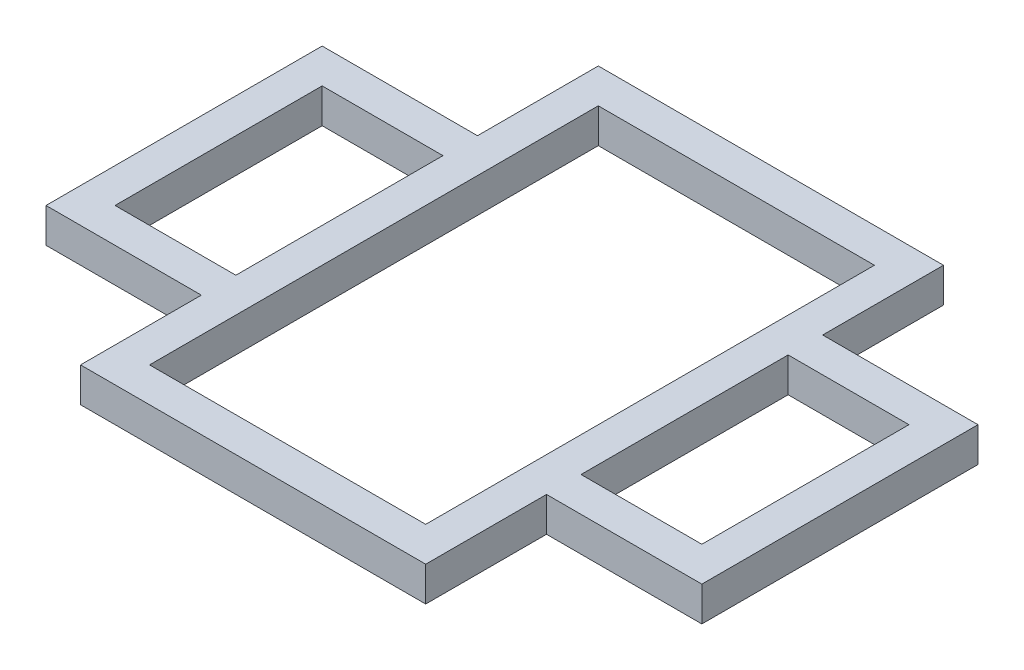
ISO-10303-21;
HEADER;
FILE_DESCRIPTION(('STEP AP214'),'2;1');
FILE_NAME('part.step','',(''),(''),'','','');
FILE_SCHEMA(('AUTOMOTIVE_DESIGN { 1 0 10303 214 1 1 1 1 }'));
ENDSEC;
DATA;
#1=APPLICATION_CONTEXT('core data for automotive mechanical design processes');
#2=APPLICATION_PROTOCOL_DEFINITION('international standard','automotive_design',2000,#1);
#3=PRODUCT_CONTEXT('',#1,'mechanical');
#4=PRODUCT('Part','Part','',(#3));
#5=PRODUCT_RELATED_PRODUCT_CATEGORY('part','',(#4));
#6=PRODUCT_DEFINITION_FORMATION('','',#4);
#7=PRODUCT_DEFINITION_CONTEXT('part definition',#1,'design');
#8=PRODUCT_DEFINITION('design','',#6,#7);
#9=PRODUCT_DEFINITION_SHAPE('','',#8);
#10=(LENGTH_UNIT() NAMED_UNIT(*) SI_UNIT(.MILLI.,.METRE.));
#11=(NAMED_UNIT(*) PLANE_ANGLE_UNIT() SI_UNIT($,.RADIAN.));
#12=(NAMED_UNIT(*) SI_UNIT($,.STERADIAN.) SOLID_ANGLE_UNIT());
#13=UNCERTAINTY_MEASURE_WITH_UNIT(LENGTH_MEASURE(1.E-05),#10,'distance_accuracy_value','');
#14=(GEOMETRIC_REPRESENTATION_CONTEXT(3) GLOBAL_UNCERTAINTY_ASSIGNED_CONTEXT((#13)) GLOBAL_UNIT_ASSIGNED_CONTEXT((#10,
#11,#12)) REPRESENTATION_CONTEXT('',''));
#15=CARTESIAN_POINT('',(0.,0.,0.));
#16=DIRECTION('',(0.,0.,1.));
#17=DIRECTION('',(1.,0.,0.));
#18=AXIS2_PLACEMENT_3D('',#15,#16,#17);
#19=CARTESIAN_POINT('',(0.,20.,0.));
#20=DIRECTION('',(0.,-1.,0.));
#21=DIRECTION('',(0.,0.,-1.));
#22=AXIS2_PLACEMENT_3D('',#19,#20,#21);
#23=PLANE('',#22);
#24=DIRECTION('',(0.,0.,1.));
#25=VECTOR('',#24,1.);
#26=CARTESIAN_POINT('',(100.,20.,60.));
#27=LINE('',#26,#25);
#28=CARTESIAN_POINT('',(100.,20.,-60.));
#29=VERTEX_POINT('',#28);
#30=CARTESIAN_POINT('',(100.,20.,60.));
#31=VERTEX_POINT('',#30);
#32=EDGE_CURVE('E230',#29,#31,#27,.T.);
#33=ORIENTED_EDGE('',*,*,#32,.F.);
#34=DIRECTION('',(-1.,0.,0.));
#35=VECTOR('',#34,1.);
#36=CARTESIAN_POINT('',(170.,20.,-60.));
#37=LINE('',#36,#35);
#38=CARTESIAN_POINT('',(170.,20.,-60.));
#39=VERTEX_POINT('',#38);
#40=EDGE_CURVE('E238',#39,#29,#37,.T.);
#41=ORIENTED_EDGE('',*,*,#40,.F.);
#42=DIRECTION('',(0.,0.,-1.));
#43=VECTOR('',#42,1.);
#44=CARTESIAN_POINT('',(170.,20.,-60.));
#45=LINE('',#44,#43);
#46=CARTESIAN_POINT('',(170.,20.,60.));
#47=VERTEX_POINT('',#46);
#48=EDGE_CURVE('E235',#47,#39,#45,.T.);
#49=ORIENTED_EDGE('',*,*,#48,.F.);
#50=DIRECTION('',(1.,0.,0.));
#51=VECTOR('',#50,1.);
#52=CARTESIAN_POINT('',(170.,20.,60.));
#53=LINE('',#52,#51);
#54=EDGE_CURVE('E232',#31,#47,#53,.T.);
#55=ORIENTED_EDGE('',*,*,#54,.F.);
#56=EDGE_LOOP('',(#33,#41,#49,#55));
#57=FACE_BOUND('',#56,.T.);
#58=DIRECTION('',(0.,0.,1.));
#59=VECTOR('',#58,1.);
#60=CARTESIAN_POINT('',(-100.,20.,-150.));
#61=LINE('',#60,#59);
#62=CARTESIAN_POINT('',(-100.,20.,-150.));
#63=VERTEX_POINT('',#62);
#64=CARTESIAN_POINT('',(-100.,20.,-80.));
#65=VERTEX_POINT('',#64);
#66=EDGE_CURVE('E293',#63,#65,#61,.T.);
#67=ORIENTED_EDGE('',*,*,#66,.T.);
#68=DIRECTION('',(-1.,0.,0.));
#69=VECTOR('',#68,1.);
#70=CARTESIAN_POINT('',(-100.,20.,-80.));
#71=LINE('',#70,#69);
#72=CARTESIAN_POINT('',(-190.,20.,-80.));
#73=VERTEX_POINT('',#72);
#74=EDGE_CURVE('E296',#65,#73,#71,.T.);
#75=ORIENTED_EDGE('',*,*,#74,.T.);
#76=DIRECTION('',(0.,0.,1.));
#77=VECTOR('',#76,1.);
#78=CARTESIAN_POINT('',(-190.,20.,-80.));
#79=LINE('',#78,#77);
#80=CARTESIAN_POINT('',(-190.,20.,80.));
#81=VERTEX_POINT('',#80);
#82=EDGE_CURVE('E299',#73,#81,#79,.T.);
#83=ORIENTED_EDGE('',*,*,#82,.T.);
#84=DIRECTION('',(1.,0.,0.));
#85=VECTOR('',#84,1.);
#86=CARTESIAN_POINT('',(-100.,20.,80.));
#87=LINE('',#86,#85);
#88=CARTESIAN_POINT('',(-100.,20.,80.));
#89=VERTEX_POINT('',#88);
#90=EDGE_CURVE('E301',#81,#89,#87,.T.);
#91=ORIENTED_EDGE('',*,*,#90,.T.);
#92=DIRECTION('',(0.,0.,1.));
#93=VECTOR('',#92,1.);
#94=CARTESIAN_POINT('',(-100.,20.,80.));
#95=LINE('',#94,#93);
#96=CARTESIAN_POINT('',(-100.,20.,150.));
#97=VERTEX_POINT('',#96);
#98=EDGE_CURVE('E303',#89,#97,#95,.T.);
#99=ORIENTED_EDGE('',*,*,#98,.T.);
#100=DIRECTION('',(1.,0.,0.));
#101=VECTOR('',#100,1.);
#102=CARTESIAN_POINT('',(100.,20.,150.));
#103=LINE('',#102,#101);
#104=CARTESIAN_POINT('',(100.,20.,150.));
#105=VERTEX_POINT('',#104);
#106=EDGE_CURVE('E305',#97,#105,#103,.T.);
#107=ORIENTED_EDGE('',*,*,#106,.T.);
#108=DIRECTION('',(0.,0.,-1.));
#109=VECTOR('',#108,1.);
#110=CARTESIAN_POINT('',(100.,20.,150.));
#111=LINE('',#110,#109);
#112=CARTESIAN_POINT('',(100.,20.,80.));
#113=VERTEX_POINT('',#112);
#114=EDGE_CURVE('E307',#105,#113,#111,.T.);
#115=ORIENTED_EDGE('',*,*,#114,.T.);
#116=DIRECTION('',(1.,0.,0.));
#117=VECTOR('',#116,1.);
#118=CARTESIAN_POINT('',(190.,20.,80.));
#119=LINE('',#118,#117);
#120=CARTESIAN_POINT('',(190.,20.,80.));
#121=VERTEX_POINT('',#120);
#122=EDGE_CURVE('E309',#113,#121,#119,.T.);
#123=ORIENTED_EDGE('',*,*,#122,.T.);
#124=DIRECTION('',(0.,0.,-1.));
#125=VECTOR('',#124,1.);
#126=CARTESIAN_POINT('',(190.,20.,-80.));
#127=LINE('',#126,#125);
#128=CARTESIAN_POINT('',(190.,20.,-80.));
#129=VERTEX_POINT('',#128);
#130=EDGE_CURVE('E311',#121,#129,#127,.T.);
#131=ORIENTED_EDGE('',*,*,#130,.T.);
#132=DIRECTION('',(-1.,0.,0.));
#133=VECTOR('',#132,1.);
#134=CARTESIAN_POINT('',(190.,20.,-80.));
#135=LINE('',#134,#133);
#136=CARTESIAN_POINT('',(100.,20.,-80.));
#137=VERTEX_POINT('',#136);
#138=EDGE_CURVE('E313',#129,#137,#135,.T.);
#139=ORIENTED_EDGE('',*,*,#138,.T.);
#140=DIRECTION('',(0.,0.,-1.));
#141=VECTOR('',#140,1.);
#142=CARTESIAN_POINT('',(100.,20.,-80.));
#143=LINE('',#142,#141);
#144=CARTESIAN_POINT('',(100.,20.,-150.));
#145=VERTEX_POINT('',#144);
#146=EDGE_CURVE('E315',#137,#145,#143,.T.);
#147=ORIENTED_EDGE('',*,*,#146,.T.);
#148=DIRECTION('',(-1.,0.,0.));
#149=VECTOR('',#148,1.);
#150=CARTESIAN_POINT('',(-100.,20.,-150.));
#151=LINE('',#150,#149);
#152=EDGE_CURVE('E317',#145,#63,#151,.T.);
#153=ORIENTED_EDGE('',*,*,#152,.T.);
#154=EDGE_LOOP('',(#67,#75,#83,#91,#99,#107,#115,#123,#131,#139,#147,#153));
#155=FACE_BOUND('',#154,.T.);
#156=DIRECTION('',(0.,0.,1.));
#157=VECTOR('',#156,1.);
#158=CARTESIAN_POINT('',(-80.,20.,-60.));
#159=LINE('',#158,#157);
#160=CARTESIAN_POINT('',(-80.,20.,-130.));
#161=VERTEX_POINT('',#160);
#162=CARTESIAN_POINT('',(-80.,20.,130.));
#163=VERTEX_POINT('',#162);
#164=EDGE_CURVE('E261',#161,#163,#159,.T.);
#165=ORIENTED_EDGE('',*,*,#164,.F.);
#166=DIRECTION('',(-1.,0.,0.));
#167=VECTOR('',#166,1.);
#168=CARTESIAN_POINT('',(10.,20.,-130.));
#169=LINE('',#168,#167);
#170=CARTESIAN_POINT('',(80.,20.,-130.));
#171=VERTEX_POINT('',#170);
#172=EDGE_CURVE('E269',#171,#161,#169,.T.);
#173=ORIENTED_EDGE('',*,*,#172,.F.);
#174=DIRECTION('',(0.,0.,-1.));
#175=VECTOR('',#174,1.);
#176=CARTESIAN_POINT('',(80.,20.,60.));
#177=LINE('',#176,#175);
#178=CARTESIAN_POINT('',(80.,20.,130.));
#179=VERTEX_POINT('',#178);
#180=EDGE_CURVE('E266',#179,#171,#177,.T.);
#181=ORIENTED_EDGE('',*,*,#180,.F.);
#182=DIRECTION('',(1.,0.,0.));
#183=VECTOR('',#182,1.);
#184=CARTESIAN_POINT('',(-9.99999999999999,20.,130.));
#185=LINE('',#184,#183);
#186=EDGE_CURVE('E263',#163,#179,#185,.T.);
#187=ORIENTED_EDGE('',*,*,#186,.F.);
#188=EDGE_LOOP('',(#165,#173,#181,#187));
#189=FACE_BOUND('',#188,.T.);
#190=DIRECTION('',(0.,0.,-1.));
#191=VECTOR('',#190,1.);
#192=CARTESIAN_POINT('',(-100.,20.,-60.));
#193=LINE('',#192,#191);
#194=CARTESIAN_POINT('',(-100.,20.,60.));
#195=VERTEX_POINT('',#194);
#196=CARTESIAN_POINT('',(-100.,20.,-60.));
#197=VERTEX_POINT('',#196);
#198=EDGE_CURVE('E194',#195,#197,#193,.T.);
#199=ORIENTED_EDGE('',*,*,#198,.F.);
#200=DIRECTION('',(1.,0.,0.));
#201=VECTOR('',#200,1.);
#202=CARTESIAN_POINT('',(-100.,20.,60.));
#203=LINE('',#202,#201);
#204=CARTESIAN_POINT('',(-170.,20.,60.));
#205=VERTEX_POINT('',#204);
#206=EDGE_CURVE('E216',#205,#195,#203,.T.);
#207=ORIENTED_EDGE('',*,*,#206,.F.);
#208=DIRECTION('',(0.,0.,1.));
#209=VECTOR('',#208,1.);
#210=CARTESIAN_POINT('',(-170.,20.,-60.));
#211=LINE('',#210,#209);
#212=CARTESIAN_POINT('',(-170.,20.,-60.));
#213=VERTEX_POINT('',#212);
#214=EDGE_CURVE('E214',#213,#205,#211,.T.);
#215=ORIENTED_EDGE('',*,*,#214,.F.);
#216=DIRECTION('',(-1.,0.,0.));
#217=VECTOR('',#216,1.);
#218=CARTESIAN_POINT('',(-100.,20.,-60.));
#219=LINE('',#218,#217);
#220=EDGE_CURVE('E202',#197,#213,#219,.T.);
#221=ORIENTED_EDGE('',*,*,#220,.F.);
#222=EDGE_LOOP('',(#199,#207,#215,#221));
#223=FACE_BOUND('',#222,.T.);
#224=ADVANCED_FACE('F33',(#57,#155,#189,#223),#23,.F.);
#225=CARTESIAN_POINT('',(0.,0.,0.));
#226=DIRECTION('',(0.,-1.,0.));
#227=DIRECTION('',(0.,0.,-1.));
#228=AXIS2_PLACEMENT_3D('',#225,#226,#227);
#229=PLANE('',#228);
#230=DIRECTION('',(0.,0.,1.));
#231=VECTOR('',#230,1.);
#232=CARTESIAN_POINT('',(-100.,0.,-150.));
#233=LINE('',#232,#231);
#234=CARTESIAN_POINT('',(-100.,0.,-150.));
#235=VERTEX_POINT('',#234);
#236=CARTESIAN_POINT('',(-100.,0.,-80.));
#237=VERTEX_POINT('',#236);
#238=EDGE_CURVE('E292',#235,#237,#233,.T.);
#239=ORIENTED_EDGE('',*,*,#238,.F.);
#240=DIRECTION('',(-1.,0.,0.));
#241=VECTOR('',#240,1.);
#242=CARTESIAN_POINT('',(-100.,0.,-150.));
#243=LINE('',#242,#241);
#244=CARTESIAN_POINT('',(100.,0.,-150.));
#245=VERTEX_POINT('',#244);
#246=EDGE_CURVE('E297',#245,#235,#243,.T.);
#247=ORIENTED_EDGE('',*,*,#246,.F.);
#248=DIRECTION('',(0.,0.,-1.));
#249=VECTOR('',#248,1.);
#250=CARTESIAN_POINT('',(100.,0.,-80.));
#251=LINE('',#250,#249);
#252=CARTESIAN_POINT('',(100.,0.,-80.));
#253=VERTEX_POINT('',#252);
#254=EDGE_CURVE('E340',#253,#245,#251,.T.);
#255=ORIENTED_EDGE('',*,*,#254,.F.);
#256=DIRECTION('',(-1.,0.,0.));
#257=VECTOR('',#256,1.);
#258=CARTESIAN_POINT('',(190.,0.,-80.));
#259=LINE('',#258,#257);
#260=CARTESIAN_POINT('',(190.,0.,-80.));
#261=VERTEX_POINT('',#260);
#262=EDGE_CURVE('E338',#261,#253,#259,.T.);
#263=ORIENTED_EDGE('',*,*,#262,.F.);
#264=DIRECTION('',(0.,0.,-1.));
#265=VECTOR('',#264,1.);
#266=CARTESIAN_POINT('',(190.,0.,-80.));
#267=LINE('',#266,#265);
#268=CARTESIAN_POINT('',(190.,0.,80.));
#269=VERTEX_POINT('',#268);
#270=EDGE_CURVE('E336',#269,#261,#267,.T.);
#271=ORIENTED_EDGE('',*,*,#270,.F.);
#272=DIRECTION('',(1.,0.,0.));
#273=VECTOR('',#272,1.);
#274=CARTESIAN_POINT('',(190.,0.,80.));
#275=LINE('',#274,#273);
#276=CARTESIAN_POINT('',(100.,0.,80.));
#277=VERTEX_POINT('',#276);
#278=EDGE_CURVE('E334',#277,#269,#275,.T.);
#279=ORIENTED_EDGE('',*,*,#278,.F.);
#280=DIRECTION('',(0.,0.,-1.));
#281=VECTOR('',#280,1.);
#282=CARTESIAN_POINT('',(100.,0.,150.));
#283=LINE('',#282,#281);
#284=CARTESIAN_POINT('',(100.,0.,150.));
#285=VERTEX_POINT('',#284);
#286=EDGE_CURVE('E332',#285,#277,#283,.T.);
#287=ORIENTED_EDGE('',*,*,#286,.F.);
#288=DIRECTION('',(1.,0.,0.));
#289=VECTOR('',#288,1.);
#290=CARTESIAN_POINT('',(100.,0.,150.));
#291=LINE('',#290,#289);
#292=CARTESIAN_POINT('',(-100.,0.,150.));
#293=VERTEX_POINT('',#292);
#294=EDGE_CURVE('E330',#293,#285,#291,.T.);
#295=ORIENTED_EDGE('',*,*,#294,.F.);
#296=DIRECTION('',(0.,0.,1.));
#297=VECTOR('',#296,1.);
#298=CARTESIAN_POINT('',(-100.,0.,80.));
#299=LINE('',#298,#297);
#300=CARTESIAN_POINT('',(-100.,0.,80.));
#301=VERTEX_POINT('',#300);
#302=EDGE_CURVE('E328',#301,#293,#299,.T.);
#303=ORIENTED_EDGE('',*,*,#302,.F.);
#304=DIRECTION('',(1.,0.,0.));
#305=VECTOR('',#304,1.);
#306=CARTESIAN_POINT('',(-100.,0.,80.));
#307=LINE('',#306,#305);
#308=CARTESIAN_POINT('',(-190.,0.,80.));
#309=VERTEX_POINT('',#308);
#310=EDGE_CURVE('E326',#309,#301,#307,.T.);
#311=ORIENTED_EDGE('',*,*,#310,.F.);
#312=DIRECTION('',(0.,0.,1.));
#313=VECTOR('',#312,1.);
#314=CARTESIAN_POINT('',(-190.,0.,-80.));
#315=LINE('',#314,#313);
#316=CARTESIAN_POINT('',(-190.,0.,-80.));
#317=VERTEX_POINT('',#316);
#318=EDGE_CURVE('E324',#317,#309,#315,.T.);
#319=ORIENTED_EDGE('',*,*,#318,.F.);
#320=DIRECTION('',(-1.,0.,0.));
#321=VECTOR('',#320,1.);
#322=CARTESIAN_POINT('',(-100.,0.,-80.));
#323=LINE('',#322,#321);
#324=EDGE_CURVE('E322',#237,#317,#323,.T.);
#325=ORIENTED_EDGE('',*,*,#324,.F.);
#326=EDGE_LOOP('',(#239,#247,#255,#263,#271,#279,#287,#295,#303,#311,#319,#325));
#327=FACE_BOUND('',#326,.T.);
#328=DIRECTION('',(-1.,0.,0.));
#329=VECTOR('',#328,1.);
#330=CARTESIAN_POINT('',(-80.,0.,-130.));
#331=LINE('',#330,#329);
#332=CARTESIAN_POINT('',(80.,0.,-130.));
#333=VERTEX_POINT('',#332);
#334=CARTESIAN_POINT('',(-80.,0.,-130.));
#335=VERTEX_POINT('',#334);
#336=EDGE_CURVE('E264',#333,#335,#331,.T.);
#337=ORIENTED_EDGE('',*,*,#336,.T.);
#338=DIRECTION('',(0.,0.,1.));
#339=VECTOR('',#338,1.);
#340=CARTESIAN_POINT('',(-80.,0.,130.));
#341=LINE('',#340,#339);
#342=CARTESIAN_POINT('',(-80.,0.,130.));
#343=VERTEX_POINT('',#342);
#344=EDGE_CURVE('E260',#335,#343,#341,.T.);
#345=ORIENTED_EDGE('',*,*,#344,.T.);
#346=DIRECTION('',(1.,0.,0.));
#347=VECTOR('',#346,1.);
#348=CARTESIAN_POINT('',(80.,0.,130.));
#349=LINE('',#348,#347);
#350=CARTESIAN_POINT('',(80.,0.,130.));
#351=VERTEX_POINT('',#350);
#352=EDGE_CURVE('E274',#343,#351,#349,.T.);
#353=ORIENTED_EDGE('',*,*,#352,.T.);
#354=DIRECTION('',(0.,0.,-1.));
#355=VECTOR('',#354,1.);
#356=CARTESIAN_POINT('',(80.,0.,-130.));
#357=LINE('',#356,#355);
#358=EDGE_CURVE('E277',#351,#333,#357,.T.);
#359=ORIENTED_EDGE('',*,*,#358,.T.);
#360=EDGE_LOOP('',(#337,#345,#353,#359));
#361=FACE_BOUND('',#360,.T.);
#362=DIRECTION('',(-1.,0.,0.));
#363=VECTOR('',#362,1.);
#364=CARTESIAN_POINT('',(170.,0.,-60.));
#365=LINE('',#364,#363);
#366=CARTESIAN_POINT('',(170.,0.,-60.));
#367=VERTEX_POINT('',#366);
#368=CARTESIAN_POINT('',(100.,0.,-60.));
#369=VERTEX_POINT('',#368);
#370=EDGE_CURVE('E233',#367,#369,#365,.T.);
#371=ORIENTED_EDGE('',*,*,#370,.T.);
#372=DIRECTION('',(0.,0.,1.));
#373=VECTOR('',#372,1.);
#374=CARTESIAN_POINT('',(100.,0.,60.));
#375=LINE('',#374,#373);
#376=CARTESIAN_POINT('',(100.,0.,60.));
#377=VERTEX_POINT('',#376);
#378=EDGE_CURVE('E210',#369,#377,#375,.T.);
#379=ORIENTED_EDGE('',*,*,#378,.T.);
#380=DIRECTION('',(1.,0.,0.));
#381=VECTOR('',#380,1.);
#382=CARTESIAN_POINT('',(170.,0.,60.));
#383=LINE('',#382,#381);
#384=CARTESIAN_POINT('',(170.,0.,60.));
#385=VERTEX_POINT('',#384);
#386=EDGE_CURVE('E243',#377,#385,#383,.T.);
#387=ORIENTED_EDGE('',*,*,#386,.T.);
#388=DIRECTION('',(0.,0.,-1.));
#389=VECTOR('',#388,1.);
#390=CARTESIAN_POINT('',(170.,0.,-60.));
#391=LINE('',#390,#389);
#392=EDGE_CURVE('E246',#385,#367,#391,.T.);
#393=ORIENTED_EDGE('',*,*,#392,.T.);
#394=EDGE_LOOP('',(#371,#379,#387,#393));
#395=FACE_BOUND('',#394,.T.);
#396=DIRECTION('',(1.,0.,0.));
#397=VECTOR('',#396,1.);
#398=CARTESIAN_POINT('',(-100.,0.,60.));
#399=LINE('',#398,#397);
#400=CARTESIAN_POINT('',(-170.,0.,60.));
#401=VERTEX_POINT('',#400);
#402=CARTESIAN_POINT('',(-100.,0.,60.));
#403=VERTEX_POINT('',#402);
#404=EDGE_CURVE('E203',#401,#403,#399,.T.);
#405=ORIENTED_EDGE('',*,*,#404,.T.);
#406=DIRECTION('',(0.,0.,-1.));
#407=VECTOR('',#406,1.);
#408=CARTESIAN_POINT('',(-100.,0.,-60.));
#409=LINE('',#408,#407);
#410=CARTESIAN_POINT('',(-100.,0.,-60.));
#411=VERTEX_POINT('',#410);
#412=EDGE_CURVE('E56',#403,#411,#409,.T.);
#413=ORIENTED_EDGE('',*,*,#412,.T.);
#414=DIRECTION('',(-1.,0.,0.));
#415=VECTOR('',#414,1.);
#416=CARTESIAN_POINT('',(-100.,0.,-60.));
#417=LINE('',#416,#415);
#418=CARTESIAN_POINT('',(-170.,0.,-60.));
#419=VERTEX_POINT('',#418);
#420=EDGE_CURVE('E209',#411,#419,#417,.T.);
#421=ORIENTED_EDGE('',*,*,#420,.T.);
#422=DIRECTION('',(0.,0.,1.));
#423=VECTOR('',#422,1.);
#424=CARTESIAN_POINT('',(-170.,0.,-60.));
#425=LINE('',#424,#423);
#426=EDGE_CURVE('E222',#419,#401,#425,.T.);
#427=ORIENTED_EDGE('',*,*,#426,.T.);
#428=EDGE_LOOP('',(#405,#413,#421,#427));
#429=FACE_BOUND('',#428,.T.);
#430=ADVANCED_FACE('F382',(#327,#361,#395,#429),#229,.T.);
#431=CARTESIAN_POINT('',(-100.,20.,-150.));
#432=DIRECTION('',(1.,0.,0.));
#433=DIRECTION('',(0.,0.,-1.));
#434=AXIS2_PLACEMENT_3D('',#431,#432,#433);
#435=PLANE('',#434);
#436=ORIENTED_EDGE('',*,*,#238,.T.);
#437=DIRECTION('',(0.,-1.,0.));
#438=VECTOR('',#437,1.);
#439=CARTESIAN_POINT('',(-100.,20.,-80.));
#440=LINE('',#439,#438);
#441=EDGE_CURVE('E11',#65,#237,#440,.T.);
#442=ORIENTED_EDGE('',*,*,#441,.F.);
#443=ORIENTED_EDGE('',*,*,#66,.F.);
#444=DIRECTION('',(0.,-1.,0.));
#445=VECTOR('',#444,1.);
#446=CARTESIAN_POINT('',(-100.,20.,-150.));
#447=LINE('',#446,#445);
#448=EDGE_CURVE('E319',#63,#235,#447,.T.);
#449=ORIENTED_EDGE('',*,*,#448,.T.);
#450=EDGE_LOOP('',(#436,#442,#443,#449));
#451=FACE_BOUND('',#450,.T.);
#452=ADVANCED_FACE('F35',(#451),#435,.F.);
#453=CARTESIAN_POINT('',(-100.,20.,-80.));
#454=DIRECTION('',(0.,0.,1.));
#455=DIRECTION('',(1.,0.,0.));
#456=AXIS2_PLACEMENT_3D('',#453,#454,#455);
#457=PLANE('',#456);
#458=ORIENTED_EDGE('',*,*,#324,.T.);
#459=DIRECTION('',(0.,-1.,0.));
#460=VECTOR('',#459,1.);
#461=CARTESIAN_POINT('',(-190.,20.,-80.));
#462=LINE('',#461,#460);
#463=EDGE_CURVE('E41',#73,#317,#462,.T.);
#464=ORIENTED_EDGE('',*,*,#463,.F.);
#465=ORIENTED_EDGE('',*,*,#74,.F.);
#466=ORIENTED_EDGE('',*,*,#441,.T.);
#467=EDGE_LOOP('',(#458,#464,#465,#466));
#468=FACE_BOUND('',#467,.T.);
#469=ADVANCED_FACE('F400',(#468),#457,.F.);
#470=CARTESIAN_POINT('',(-190.,20.,-80.));
#471=DIRECTION('',(1.,0.,0.));
#472=DIRECTION('',(0.,0.,-1.));
#473=AXIS2_PLACEMENT_3D('',#470,#471,#472);
#474=PLANE('',#473);
#475=ORIENTED_EDGE('',*,*,#318,.T.);
#476=DIRECTION('',(0.,-1.,0.));
#477=VECTOR('',#476,1.);
#478=CARTESIAN_POINT('',(-190.,20.,80.));
#479=LINE('',#478,#477);
#480=EDGE_CURVE('E369',#81,#309,#479,.T.);
#481=ORIENTED_EDGE('',*,*,#480,.F.);
#482=ORIENTED_EDGE('',*,*,#82,.F.);
#483=ORIENTED_EDGE('',*,*,#463,.T.);
#484=EDGE_LOOP('',(#475,#481,#482,#483));
#485=FACE_BOUND('',#484,.T.);
#486=ADVANCED_FACE('F376',(#485),#474,.F.);
#487=CARTESIAN_POINT('',(-100.,20.,80.));
#488=DIRECTION('',(0.,0.,-1.));
#489=DIRECTION('',(-1.,0.,0.));
#490=AXIS2_PLACEMENT_3D('',#487,#488,#489);
#491=PLANE('',#490);
#492=ORIENTED_EDGE('',*,*,#310,.T.);
#493=DIRECTION('',(0.,-1.,0.));
#494=VECTOR('',#493,1.);
#495=CARTESIAN_POINT('',(-100.,20.,80.));
#496=LINE('',#495,#494);
#497=EDGE_CURVE('E366',#89,#301,#496,.T.);
#498=ORIENTED_EDGE('',*,*,#497,.F.);
#499=ORIENTED_EDGE('',*,*,#90,.F.);
#500=ORIENTED_EDGE('',*,*,#480,.T.);
#501=EDGE_LOOP('',(#492,#498,#499,#500));
#502=FACE_BOUND('',#501,.T.);
#503=ADVANCED_FACE('F388',(#502),#491,.F.);
#504=CARTESIAN_POINT('',(-100.,20.,80.));
#505=DIRECTION('',(1.,0.,0.));
#506=DIRECTION('',(0.,0.,-1.));
#507=AXIS2_PLACEMENT_3D('',#504,#505,#506);
#508=PLANE('',#507);
#509=ORIENTED_EDGE('',*,*,#302,.T.);
#510=DIRECTION('',(0.,-1.,0.));
#511=VECTOR('',#510,1.);
#512=CARTESIAN_POINT('',(-100.,20.,150.));
#513=LINE('',#512,#511);
#514=EDGE_CURVE('E363',#97,#293,#513,.T.);
#515=ORIENTED_EDGE('',*,*,#514,.F.);
#516=ORIENTED_EDGE('',*,*,#98,.F.);
#517=ORIENTED_EDGE('',*,*,#497,.T.);
#518=EDGE_LOOP('',(#509,#515,#516,#517));
#519=FACE_BOUND('',#518,.T.);
#520=ADVANCED_FACE('F392',(#519),#508,.F.);
#521=CARTESIAN_POINT('',(100.,20.,150.));
#522=DIRECTION('',(0.,0.,-1.));
#523=DIRECTION('',(-1.,0.,0.));
#524=AXIS2_PLACEMENT_3D('',#521,#522,#523);
#525=PLANE('',#524);
#526=ORIENTED_EDGE('',*,*,#294,.T.);
#527=DIRECTION('',(0.,-1.,0.));
#528=VECTOR('',#527,1.);
#529=CARTESIAN_POINT('',(100.,20.,150.));
#530=LINE('',#529,#528);
#531=EDGE_CURVE('E360',#105,#285,#530,.T.);
#532=ORIENTED_EDGE('',*,*,#531,.F.);
#533=ORIENTED_EDGE('',*,*,#106,.F.);
#534=ORIENTED_EDGE('',*,*,#514,.T.);
#535=EDGE_LOOP('',(#526,#532,#533,#534));
#536=FACE_BOUND('',#535,.T.);
#537=ADVANCED_FACE('F433',(#536),#525,.F.);
#538=CARTESIAN_POINT('',(100.,20.,150.));
#539=DIRECTION('',(-1.,0.,0.));
#540=DIRECTION('',(0.,0.,1.));
#541=AXIS2_PLACEMENT_3D('',#538,#539,#540);
#542=PLANE('',#541);
#543=ORIENTED_EDGE('',*,*,#286,.T.);
#544=DIRECTION('',(0.,-1.,0.));
#545=VECTOR('',#544,1.);
#546=CARTESIAN_POINT('',(100.,20.,80.));
#547=LINE('',#546,#545);
#548=EDGE_CURVE('E357',#113,#277,#547,.T.);
#549=ORIENTED_EDGE('',*,*,#548,.F.);
#550=ORIENTED_EDGE('',*,*,#114,.F.);
#551=ORIENTED_EDGE('',*,*,#531,.T.);
#552=EDGE_LOOP('',(#543,#549,#550,#551));
#553=FACE_BOUND('',#552,.T.);
#554=ADVANCED_FACE('F431',(#553),#542,.F.);
#555=CARTESIAN_POINT('',(190.,20.,80.));
#556=DIRECTION('',(0.,0.,-1.));
#557=DIRECTION('',(-1.,0.,0.));
#558=AXIS2_PLACEMENT_3D('',#555,#556,#557);
#559=PLANE('',#558);
#560=ORIENTED_EDGE('',*,*,#278,.T.);
#561=DIRECTION('',(0.,-1.,0.));
#562=VECTOR('',#561,1.);
#563=CARTESIAN_POINT('',(190.,20.,80.));
#564=LINE('',#563,#562);
#565=EDGE_CURVE('E354',#121,#269,#564,.T.);
#566=ORIENTED_EDGE('',*,*,#565,.F.);
#567=ORIENTED_EDGE('',*,*,#122,.F.);
#568=ORIENTED_EDGE('',*,*,#548,.T.);
#569=EDGE_LOOP('',(#560,#566,#567,#568));
#570=FACE_BOUND('',#569,.T.);
#571=ADVANCED_FACE('F427',(#570),#559,.F.);
#572=CARTESIAN_POINT('',(190.,20.,-80.));
#573=DIRECTION('',(-1.,0.,0.));
#574=DIRECTION('',(0.,0.,1.));
#575=AXIS2_PLACEMENT_3D('',#572,#573,#574);
#576=PLANE('',#575);
#577=ORIENTED_EDGE('',*,*,#270,.T.);
#578=DIRECTION('',(0.,-1.,0.));
#579=VECTOR('',#578,1.);
#580=CARTESIAN_POINT('',(190.,20.,-80.));
#581=LINE('',#580,#579);
#582=EDGE_CURVE('E351',#129,#261,#581,.T.);
#583=ORIENTED_EDGE('',*,*,#582,.F.);
#584=ORIENTED_EDGE('',*,*,#130,.F.);
#585=ORIENTED_EDGE('',*,*,#565,.T.);
#586=EDGE_LOOP('',(#577,#583,#584,#585));
#587=FACE_BOUND('',#586,.T.);
#588=ADVANCED_FACE('F422',(#587),#576,.F.);
#589=CARTESIAN_POINT('',(190.,20.,-80.));
#590=DIRECTION('',(0.,0.,1.));
#591=DIRECTION('',(1.,0.,0.));
#592=AXIS2_PLACEMENT_3D('',#589,#590,#591);
#593=PLANE('',#592);
#594=ORIENTED_EDGE('',*,*,#262,.T.);
#595=DIRECTION('',(0.,-1.,0.));
#596=VECTOR('',#595,1.);
#597=CARTESIAN_POINT('',(100.,20.,-80.));
#598=LINE('',#597,#596);
#599=EDGE_CURVE('E348',#137,#253,#598,.T.);
#600=ORIENTED_EDGE('',*,*,#599,.F.);
#601=ORIENTED_EDGE('',*,*,#138,.F.);
#602=ORIENTED_EDGE('',*,*,#582,.T.);
#603=EDGE_LOOP('',(#594,#600,#601,#602));
#604=FACE_BOUND('',#603,.T.);
#605=ADVANCED_FACE('F416',(#604),#593,.F.);
#606=CARTESIAN_POINT('',(100.,20.,-80.));
#607=DIRECTION('',(-1.,0.,0.));
#608=DIRECTION('',(0.,0.,1.));
#609=AXIS2_PLACEMENT_3D('',#606,#607,#608);
#610=PLANE('',#609);
#611=ORIENTED_EDGE('',*,*,#254,.T.);
#612=DIRECTION('',(0.,-1.,0.));
#613=VECTOR('',#612,1.);
#614=CARTESIAN_POINT('',(100.,20.,-150.));
#615=LINE('',#614,#613);
#616=EDGE_CURVE('E345',#145,#245,#615,.T.);
#617=ORIENTED_EDGE('',*,*,#616,.F.);
#618=ORIENTED_EDGE('',*,*,#146,.F.);
#619=ORIENTED_EDGE('',*,*,#599,.T.);
#620=EDGE_LOOP('',(#611,#617,#618,#619));
#621=FACE_BOUND('',#620,.T.);
#622=ADVANCED_FACE('F412',(#621),#610,.F.);
#623=CARTESIAN_POINT('',(-100.,20.,-150.));
#624=DIRECTION('',(0.,0.,1.));
#625=DIRECTION('',(1.,0.,0.));
#626=AXIS2_PLACEMENT_3D('',#623,#624,#625);
#627=PLANE('',#626);
#628=ORIENTED_EDGE('',*,*,#246,.T.);
#629=ORIENTED_EDGE('',*,*,#448,.F.);
#630=ORIENTED_EDGE('',*,*,#152,.F.);
#631=ORIENTED_EDGE('',*,*,#616,.T.);
#632=EDGE_LOOP('',(#628,#629,#630,#631));
#633=FACE_BOUND('',#632,.T.);
#634=ADVANCED_FACE('F407',(#633),#627,.F.);
#635=CARTESIAN_POINT('',(-80.,20.,130.));
#636=DIRECTION('',(1.,0.,0.));
#637=DIRECTION('',(0.,0.,-1.));
#638=AXIS2_PLACEMENT_3D('',#635,#636,#637);
#639=PLANE('',#638);
#640=ORIENTED_EDGE('',*,*,#344,.F.);
#641=DIRECTION('',(0.,-1.,0.));
#642=VECTOR('',#641,1.);
#643=CARTESIAN_POINT('',(-80.,20.,-130.));
#644=LINE('',#643,#642);
#645=EDGE_CURVE('E271',#161,#335,#644,.T.);
#646=ORIENTED_EDGE('',*,*,#645,.F.);
#647=ORIENTED_EDGE('',*,*,#164,.T.);
#648=DIRECTION('',(0.,-1.,0.));
#649=VECTOR('',#648,1.);
#650=CARTESIAN_POINT('',(-80.,20.,130.));
#651=LINE('',#650,#649);
#652=EDGE_CURVE('E289',#163,#343,#651,.T.);
#653=ORIENTED_EDGE('',*,*,#652,.T.);
#654=EDGE_LOOP('',(#640,#646,#647,#653));
#655=FACE_BOUND('',#654,.T.);
#656=ADVANCED_FACE('F451',(#655),#639,.T.);
#657=CARTESIAN_POINT('',(80.,20.,130.));
#658=DIRECTION('',(0.,0.,-1.));
#659=DIRECTION('',(-1.,0.,0.));
#660=AXIS2_PLACEMENT_3D('',#657,#658,#659);
#661=PLANE('',#660);
#662=ORIENTED_EDGE('',*,*,#352,.F.);
#663=ORIENTED_EDGE('',*,*,#652,.F.);
#664=ORIENTED_EDGE('',*,*,#186,.T.);
#665=DIRECTION('',(0.,-1.,0.));
#666=VECTOR('',#665,1.);
#667=CARTESIAN_POINT('',(80.,20.,130.));
#668=LINE('',#667,#666);
#669=EDGE_CURVE('E286',#179,#351,#668,.T.);
#670=ORIENTED_EDGE('',*,*,#669,.T.);
#671=EDGE_LOOP('',(#662,#663,#664,#670));
#672=FACE_BOUND('',#671,.T.);
#673=ADVANCED_FACE('F489',(#672),#661,.T.);
#674=CARTESIAN_POINT('',(80.,20.,-130.));
#675=DIRECTION('',(-1.,0.,0.));
#676=DIRECTION('',(0.,0.,1.));
#677=AXIS2_PLACEMENT_3D('',#674,#675,#676);
#678=PLANE('',#677);
#679=ORIENTED_EDGE('',*,*,#358,.F.);
#680=ORIENTED_EDGE('',*,*,#669,.F.);
#681=ORIENTED_EDGE('',*,*,#180,.T.);
#682=DIRECTION('',(0.,-1.,0.));
#683=VECTOR('',#682,1.);
#684=CARTESIAN_POINT('',(80.,20.,-130.));
#685=LINE('',#684,#683);
#686=EDGE_CURVE('E283',#171,#333,#685,.T.);
#687=ORIENTED_EDGE('',*,*,#686,.T.);
#688=EDGE_LOOP('',(#679,#680,#681,#687));
#689=FACE_BOUND('',#688,.T.);
#690=ADVANCED_FACE('F496',(#689),#678,.T.);
#691=CARTESIAN_POINT('',(-80.,20.,-130.));
#692=DIRECTION('',(0.,0.,1.));
#693=DIRECTION('',(1.,0.,0.));
#694=AXIS2_PLACEMENT_3D('',#691,#692,#693);
#695=PLANE('',#694);
#696=ORIENTED_EDGE('',*,*,#336,.F.);
#697=ORIENTED_EDGE('',*,*,#686,.F.);
#698=ORIENTED_EDGE('',*,*,#172,.T.);
#699=ORIENTED_EDGE('',*,*,#645,.T.);
#700=EDGE_LOOP('',(#696,#697,#698,#699));
#701=FACE_BOUND('',#700,.T.);
#702=ADVANCED_FACE('F503',(#701),#695,.T.);
#703=CARTESIAN_POINT('',(100.,20.,60.));
#704=DIRECTION('',(1.,0.,0.));
#705=DIRECTION('',(0.,0.,-1.));
#706=AXIS2_PLACEMENT_3D('',#703,#704,#705);
#707=PLANE('',#706);
#708=ORIENTED_EDGE('',*,*,#378,.F.);
#709=DIRECTION('',(0.,-1.,0.));
#710=VECTOR('',#709,1.);
#711=CARTESIAN_POINT('',(100.,20.,-60.));
#712=LINE('',#711,#710);
#713=EDGE_CURVE('E240',#29,#369,#712,.T.);
#714=ORIENTED_EDGE('',*,*,#713,.F.);
#715=ORIENTED_EDGE('',*,*,#32,.T.);
#716=DIRECTION('',(0.,-1.,0.));
#717=VECTOR('',#716,1.);
#718=CARTESIAN_POINT('',(100.,20.,60.));
#719=LINE('',#718,#717);
#720=EDGE_CURVE('E257',#31,#377,#719,.T.);
#721=ORIENTED_EDGE('',*,*,#720,.T.);
#722=EDGE_LOOP('',(#708,#714,#715,#721));
#723=FACE_BOUND('',#722,.T.);
#724=ADVANCED_FACE('F511',(#723),#707,.T.);
#725=CARTESIAN_POINT('',(170.,20.,60.));
#726=DIRECTION('',(0.,0.,-1.));
#727=DIRECTION('',(-1.,0.,0.));
#728=AXIS2_PLACEMENT_3D('',#725,#726,#727);
#729=PLANE('',#728);
#730=ORIENTED_EDGE('',*,*,#386,.F.);
#731=ORIENTED_EDGE('',*,*,#720,.F.);
#732=ORIENTED_EDGE('',*,*,#54,.T.);
#733=DIRECTION('',(0.,-1.,0.));
#734=VECTOR('',#733,1.);
#735=CARTESIAN_POINT('',(170.,20.,60.));
#736=LINE('',#735,#734);
#737=EDGE_CURVE('E255',#47,#385,#736,.T.);
#738=ORIENTED_EDGE('',*,*,#737,.T.);
#739=EDGE_LOOP('',(#730,#731,#732,#738));
#740=FACE_BOUND('',#739,.T.);
#741=ADVANCED_FACE('F519',(#740),#729,.T.);
#742=CARTESIAN_POINT('',(170.,20.,-60.));
#743=DIRECTION('',(-1.,0.,0.));
#744=DIRECTION('',(0.,0.,1.));
#745=AXIS2_PLACEMENT_3D('',#742,#743,#744);
#746=PLANE('',#745);
#747=ORIENTED_EDGE('',*,*,#392,.F.);
#748=ORIENTED_EDGE('',*,*,#737,.F.);
#749=ORIENTED_EDGE('',*,*,#48,.T.);
#750=DIRECTION('',(0.,-1.,0.));
#751=VECTOR('',#750,1.);
#752=CARTESIAN_POINT('',(170.,20.,-60.));
#753=LINE('',#752,#751);
#754=EDGE_CURVE('E253',#39,#367,#753,.T.);
#755=ORIENTED_EDGE('',*,*,#754,.T.);
#756=EDGE_LOOP('',(#747,#748,#749,#755));
#757=FACE_BOUND('',#756,.T.);
#758=ADVANCED_FACE('F527',(#757),#746,.T.);
#759=CARTESIAN_POINT('',(170.,20.,-60.));
#760=DIRECTION('',(0.,0.,1.));
#761=DIRECTION('',(1.,0.,0.));
#762=AXIS2_PLACEMENT_3D('',#759,#760,#761);
#763=PLANE('',#762);
#764=ORIENTED_EDGE('',*,*,#370,.F.);
#765=ORIENTED_EDGE('',*,*,#754,.F.);
#766=ORIENTED_EDGE('',*,*,#40,.T.);
#767=ORIENTED_EDGE('',*,*,#713,.T.);
#768=EDGE_LOOP('',(#764,#765,#766,#767));
#769=FACE_BOUND('',#768,.T.);
#770=ADVANCED_FACE('F535',(#769),#763,.T.);
#771=CARTESIAN_POINT('',(-100.,20.,-60.));
#772=DIRECTION('',(-1.,0.,0.));
#773=DIRECTION('',(0.,0.,1.));
#774=AXIS2_PLACEMENT_3D('',#771,#772,#773);
#775=PLANE('',#774);
#776=ORIENTED_EDGE('',*,*,#412,.F.);
#777=DIRECTION('',(0.,-1.,0.));
#778=VECTOR('',#777,1.);
#779=CARTESIAN_POINT('',(-100.,20.,60.));
#780=LINE('',#779,#778);
#781=EDGE_CURVE('E198',#195,#403,#780,.T.);
#782=ORIENTED_EDGE('',*,*,#781,.F.);
#783=ORIENTED_EDGE('',*,*,#198,.T.);
#784=DIRECTION('',(0.,-1.,0.));
#785=VECTOR('',#784,1.);
#786=CARTESIAN_POINT('',(-100.,20.,-60.));
#787=LINE('',#786,#785);
#788=EDGE_CURVE('E197',#197,#411,#787,.T.);
#789=ORIENTED_EDGE('',*,*,#788,.T.);
#790=EDGE_LOOP('',(#776,#782,#783,#789));
#791=FACE_BOUND('',#790,.T.);
#792=ADVANCED_FACE('F196',(#791),#775,.T.);
#793=CARTESIAN_POINT('',(-100.,20.,-60.));
#794=DIRECTION('',(0.,0.,1.));
#795=DIRECTION('',(1.,0.,0.));
#796=AXIS2_PLACEMENT_3D('',#793,#794,#795);
#797=PLANE('',#796);
#798=ORIENTED_EDGE('',*,*,#420,.F.);
#799=ORIENTED_EDGE('',*,*,#788,.F.);
#800=ORIENTED_EDGE('',*,*,#220,.T.);
#801=DIRECTION('',(0.,-1.,0.));
#802=VECTOR('',#801,1.);
#803=CARTESIAN_POINT('',(-170.,20.,-60.));
#804=LINE('',#803,#802);
#805=EDGE_CURVE('E211',#213,#419,#804,.T.);
#806=ORIENTED_EDGE('',*,*,#805,.T.);
#807=EDGE_LOOP('',(#798,#799,#800,#806));
#808=FACE_BOUND('',#807,.T.);
#809=ADVANCED_FACE('F206',(#808),#797,.T.);
#810=CARTESIAN_POINT('',(-170.,20.,-60.));
#811=DIRECTION('',(1.,0.,0.));
#812=DIRECTION('',(0.,0.,-1.));
#813=AXIS2_PLACEMENT_3D('',#810,#811,#812);
#814=PLANE('',#813);
#815=ORIENTED_EDGE('',*,*,#426,.F.);
#816=ORIENTED_EDGE('',*,*,#805,.F.);
#817=ORIENTED_EDGE('',*,*,#214,.T.);
#818=DIRECTION('',(0.,-1.,0.));
#819=VECTOR('',#818,1.);
#820=CARTESIAN_POINT('',(-170.,20.,60.));
#821=LINE('',#820,#819);
#822=EDGE_CURVE('E48',#205,#401,#821,.T.);
#823=ORIENTED_EDGE('',*,*,#822,.T.);
#824=EDGE_LOOP('',(#815,#816,#817,#823));
#825=FACE_BOUND('',#824,.T.);
#826=ADVANCED_FACE('F556',(#825),#814,.T.);
#827=CARTESIAN_POINT('',(-100.,20.,60.));
#828=DIRECTION('',(0.,0.,-1.));
#829=DIRECTION('',(-1.,0.,0.));
#830=AXIS2_PLACEMENT_3D('',#827,#828,#829);
#831=PLANE('',#830);
#832=ORIENTED_EDGE('',*,*,#404,.F.);
#833=ORIENTED_EDGE('',*,*,#822,.F.);
#834=ORIENTED_EDGE('',*,*,#206,.T.);
#835=ORIENTED_EDGE('',*,*,#781,.T.);
#836=EDGE_LOOP('',(#832,#833,#834,#835));
#837=FACE_BOUND('',#836,.T.);
#838=ADVANCED_FACE('F563',(#837),#831,.T.);
#839=CLOSED_SHELL('',(#224,#430,#452,#469,#486,#503,#520,#537,#554,#571,#588,#605,#622,#634,
#656,#673,#690,#702,#724,#741,#758,#770,#792,#809,#826,#838));
#840=MANIFOLD_SOLID_BREP('B2',#839);
#841=ADVANCED_BREP_SHAPE_REPRESENTATION('',(#18,#840),#14);
#842=SHAPE_DEFINITION_REPRESENTATION(#9,#841);
ENDSEC;
END-ISO-10303-21;
